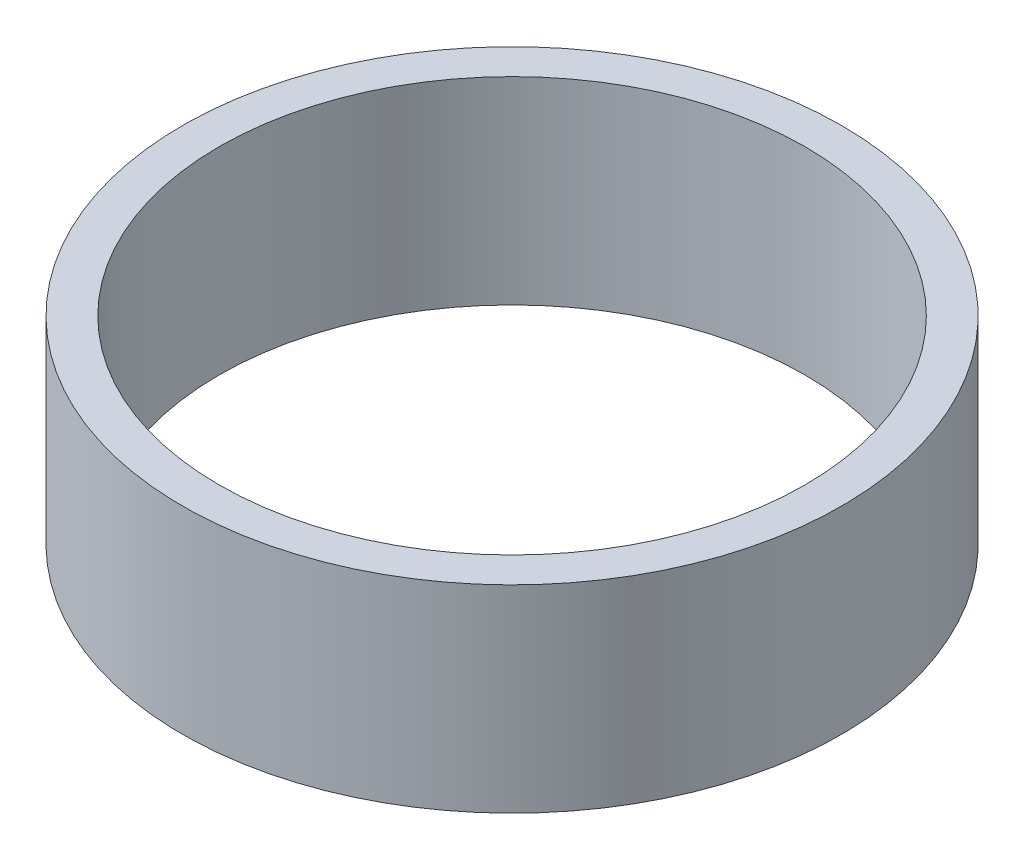
ISO-10303-21;
HEADER;
FILE_DESCRIPTION(('STEP AP214'),'2;1');
FILE_NAME('part.step','',(''),(''),'','','');
FILE_SCHEMA(('AUTOMOTIVE_DESIGN { 1 0 10303 214 1 1 1 1 }'));
ENDSEC;
DATA;
#1=APPLICATION_CONTEXT('core data for automotive mechanical design processes');
#2=APPLICATION_PROTOCOL_DEFINITION('international standard','automotive_design',2000,#1);
#3=PRODUCT_CONTEXT('',#1,'mechanical');
#4=PRODUCT('Part','Part','',(#3));
#5=PRODUCT_RELATED_PRODUCT_CATEGORY('part','',(#4));
#6=PRODUCT_DEFINITION_FORMATION('','',#4);
#7=PRODUCT_DEFINITION_CONTEXT('part definition',#1,'design');
#8=PRODUCT_DEFINITION('design','',#6,#7);
#9=PRODUCT_DEFINITION_SHAPE('','',#8);
#10=(LENGTH_UNIT() NAMED_UNIT(*) SI_UNIT(.MILLI.,.METRE.));
#11=(NAMED_UNIT(*) PLANE_ANGLE_UNIT() SI_UNIT($,.RADIAN.));
#12=(NAMED_UNIT(*) SI_UNIT($,.STERADIAN.) SOLID_ANGLE_UNIT());
#13=UNCERTAINTY_MEASURE_WITH_UNIT(LENGTH_MEASURE(1.E-05),#10,'distance_accuracy_value','');
#14=(GEOMETRIC_REPRESENTATION_CONTEXT(3) GLOBAL_UNCERTAINTY_ASSIGNED_CONTEXT((#13)) GLOBAL_UNIT_ASSIGNED_CONTEXT((#10,
#11,#12)) REPRESENTATION_CONTEXT('',''));
#15=CARTESIAN_POINT('',(0.,0.,0.));
#16=DIRECTION('',(0.,0.,1.));
#17=DIRECTION('',(1.,0.,0.));
#18=AXIS2_PLACEMENT_3D('',#15,#16,#17);
#19=CARTESIAN_POINT('',(0.,0.,0.));
#20=DIRECTION('',(0.,-1.,0.));
#21=DIRECTION('',(0.,0.,-1.));
#22=AXIS2_PLACEMENT_3D('',#19,#20,#21);
#23=CYLINDRICAL_SURFACE('',#22,12.7);
#24=CARTESIAN_POINT('',(0.,0.,0.));
#25=DIRECTION('',(0.,-1.,0.));
#26=DIRECTION('',(0.,0.,-1.));
#27=AXIS2_PLACEMENT_3D('',#24,#25,#26);
#28=CIRCLE('',#27,12.7);
#29=CARTESIAN_POINT('',(0.,0.,-12.7));
#30=VERTEX_POINT('',#29);
#31=EDGE_CURVE('E47',#30,#30,#28,.T.);
#32=ORIENTED_EDGE('',*,*,#31,.T.);
#33=EDGE_LOOP('',(#32));
#34=FACE_BOUND('',#33,.T.);
#35=CARTESIAN_POINT('',(0.,8.5725,0.));
#36=DIRECTION('',(0.,-1.,0.));
#37=DIRECTION('',(0.,0.,-1.));
#38=AXIS2_PLACEMENT_3D('',#35,#36,#37);
#39=CIRCLE('',#38,12.7);
#40=CARTESIAN_POINT('',(0.,8.5725,-12.7));
#41=VERTEX_POINT('',#40);
#42=EDGE_CURVE('E10',#41,#41,#39,.T.);
#43=ORIENTED_EDGE('',*,*,#42,.F.);
#44=EDGE_LOOP('',(#43));
#45=FACE_BOUND('',#44,.T.);
#46=ADVANCED_FACE('F33',(#34,#45),#23,.F.);
#47=CARTESIAN_POINT('',(0.,8.5725,-12.7));
#48=DIRECTION('',(0.,1.,0.));
#49=DIRECTION('',(0.,0.,1.));
#50=AXIS2_PLACEMENT_3D('',#47,#48,#49);
#51=PLANE('',#50);
#52=ORIENTED_EDGE('',*,*,#42,.T.);
#53=EDGE_LOOP('',(#52));
#54=FACE_BOUND('',#53,.T.);
#55=CARTESIAN_POINT('',(0.,8.5725,0.));
#56=DIRECTION('',(0.,-1.,0.));
#57=DIRECTION('',(0.,0.,-1.));
#58=AXIS2_PLACEMENT_3D('',#55,#56,#57);
#59=CIRCLE('',#58,14.2875);
#60=CARTESIAN_POINT('',(0.,8.5725,-14.2875));
#61=VERTEX_POINT('',#60);
#62=EDGE_CURVE('E39',#61,#61,#59,.T.);
#63=ORIENTED_EDGE('',*,*,#62,.F.);
#64=EDGE_LOOP('',(#63));
#65=FACE_BOUND('',#64,.T.);
#66=ADVANCED_FACE('F63',(#54,#65),#51,.T.);
#67=CARTESIAN_POINT('',(0.,0.,0.));
#68=DIRECTION('',(0.,-1.,0.));
#69=DIRECTION('',(0.,0.,-1.));
#70=AXIS2_PLACEMENT_3D('',#67,#68,#69);
#71=CYLINDRICAL_SURFACE('',#70,14.2875);
#72=ORIENTED_EDGE('',*,*,#62,.T.);
#73=EDGE_LOOP('',(#72));
#74=FACE_BOUND('',#73,.T.);
#75=CARTESIAN_POINT('',(0.,0.,0.));
#76=DIRECTION('',(0.,-1.,0.));
#77=DIRECTION('',(0.,0.,-1.));
#78=AXIS2_PLACEMENT_3D('',#75,#76,#77);
#79=CIRCLE('',#78,14.2875);
#80=CARTESIAN_POINT('',(0.,0.,-14.2875));
#81=VERTEX_POINT('',#80);
#82=EDGE_CURVE('E43',#81,#81,#79,.T.);
#83=ORIENTED_EDGE('',*,*,#82,.F.);
#84=EDGE_LOOP('',(#83));
#85=FACE_BOUND('',#84,.T.);
#86=ADVANCED_FACE('F57',(#74,#85),#71,.T.);
#87=CARTESIAN_POINT('',(0.,0.,-12.7));
#88=DIRECTION('',(0.,-1.,0.));
#89=DIRECTION('',(0.,0.,-1.));
#90=AXIS2_PLACEMENT_3D('',#87,#88,#89);
#91=PLANE('',#90);
#92=ORIENTED_EDGE('',*,*,#82,.T.);
#93=EDGE_LOOP('',(#92));
#94=FACE_BOUND('',#93,.T.);
#95=ORIENTED_EDGE('',*,*,#31,.F.);
#96=EDGE_LOOP('',(#95));
#97=FACE_BOUND('',#96,.T.);
#98=ADVANCED_FACE('F55',(#94,#97),#91,.T.);
#99=CLOSED_SHELL('',(#46,#66,#86,#98));
#100=MANIFOLD_SOLID_BREP('B2',#99);
#101=ADVANCED_BREP_SHAPE_REPRESENTATION('',(#18,#100),#14);
#102=SHAPE_DEFINITION_REPRESENTATION(#9,#101);
ENDSEC;
END-ISO-10303-21;
